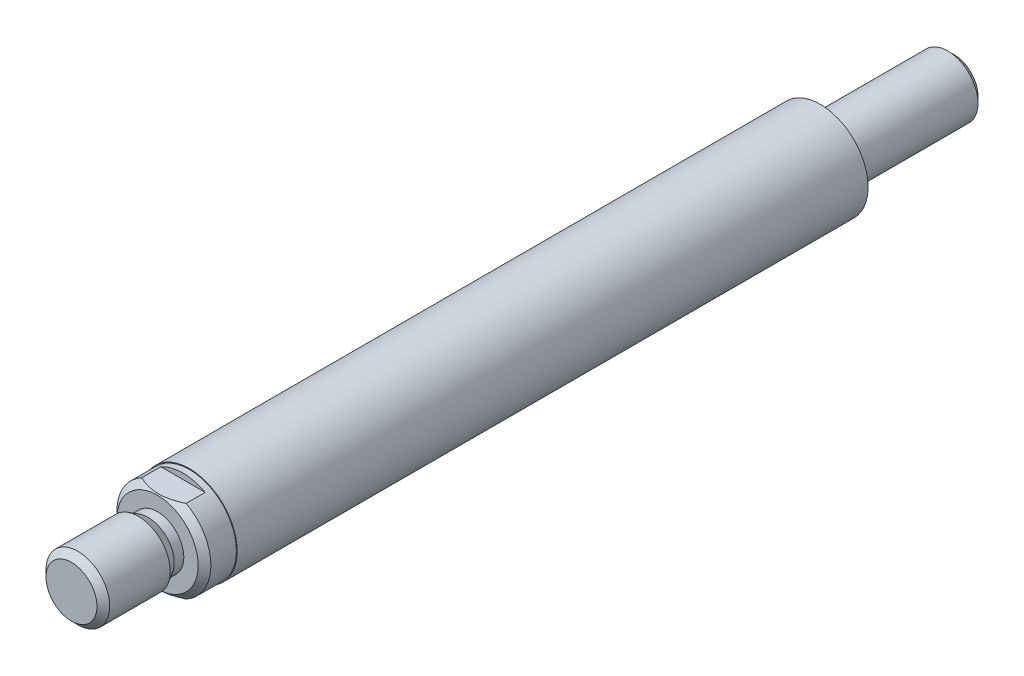
ISO-10303-21;
HEADER;
FILE_DESCRIPTION(('STEP AP214'),'2;1');
FILE_NAME('part.step','',(''),(''),'','','');
FILE_SCHEMA(('AUTOMOTIVE_DESIGN { 1 0 10303 214 1 1 1 1 }'));
ENDSEC;
DATA;
#1=APPLICATION_CONTEXT('core data for automotive mechanical design processes');
#2=APPLICATION_PROTOCOL_DEFINITION('international standard','automotive_design',2000,#1);
#3=PRODUCT_CONTEXT('',#1,'mechanical');
#4=PRODUCT('Part','Part','',(#3));
#5=PRODUCT_RELATED_PRODUCT_CATEGORY('part','',(#4));
#6=PRODUCT_DEFINITION_FORMATION('','',#4);
#7=PRODUCT_DEFINITION_CONTEXT('part definition',#1,'design');
#8=PRODUCT_DEFINITION('design','',#6,#7);
#9=PRODUCT_DEFINITION_SHAPE('','',#8);
#10=(LENGTH_UNIT() NAMED_UNIT(*) SI_UNIT(.MILLI.,.METRE.));
#11=(NAMED_UNIT(*) PLANE_ANGLE_UNIT() SI_UNIT($,.RADIAN.));
#12=(NAMED_UNIT(*) SI_UNIT($,.STERADIAN.) SOLID_ANGLE_UNIT());
#13=UNCERTAINTY_MEASURE_WITH_UNIT(LENGTH_MEASURE(1.E-05),#10,'distance_accuracy_value','');
#14=(GEOMETRIC_REPRESENTATION_CONTEXT(3) GLOBAL_UNCERTAINTY_ASSIGNED_CONTEXT((#13)) GLOBAL_UNIT_ASSIGNED_CONTEXT((#10,
#11,#12)) REPRESENTATION_CONTEXT('',''));
#15=CARTESIAN_POINT('',(0.,0.,0.));
#16=DIRECTION('',(0.,0.,1.));
#17=DIRECTION('',(1.,0.,0.));
#18=AXIS2_PLACEMENT_3D('',#15,#16,#17);
#19=CARTESIAN_POINT('',(0.,0.,277.));
#20=DIRECTION('',(0.,0.,-1.));
#21=DIRECTION('',(-1.,0.,0.));
#22=AXIS2_PLACEMENT_3D('',#19,#20,#21);
#23=CYLINDRICAL_SURFACE('',#22,15.);
#24=CARTESIAN_POINT('',(0.,0.,240.));
#25=DIRECTION('',(0.,0.,1.));
#26=DIRECTION('',(1.,0.,0.));
#27=AXIS2_PLACEMENT_3D('',#24,#25,#26);
#28=CIRCLE('',#27,15.);
#29=CARTESIAN_POINT('',(15.,0.,240.));
#30=VERTEX_POINT('',#29);
#31=EDGE_CURVE('E95',#30,#30,#28,.T.);
#32=ORIENTED_EDGE('',*,*,#31,.F.);
#33=EDGE_LOOP('',(#32));
#34=FACE_BOUND('',#33,.T.);
#35=CARTESIAN_POINT('',(0.,0.,42.));
#36=DIRECTION('',(0.,0.,-1.));
#37=DIRECTION('',(-1.,0.,0.));
#38=AXIS2_PLACEMENT_3D('',#35,#36,#37);
#39=CIRCLE('',#38,15.);
#40=CARTESIAN_POINT('',(-15.,0.,42.));
#41=VERTEX_POINT('',#40);
#42=EDGE_CURVE('E101',#41,#41,#39,.T.);
#43=ORIENTED_EDGE('',*,*,#42,.F.);
#44=EDGE_LOOP('',(#43));
#45=FACE_BOUND('',#44,.T.);
#46=ADVANCED_FACE('F34',(#34,#45),#23,.T.);
#47=CARTESIAN_POINT('',(0.,0.,240.));
#48=DIRECTION('',(0.,0.,1.));
#49=DIRECTION('',(1.,0.,0.));
#50=AXIS2_PLACEMENT_3D('',#47,#48,#49);
#51=CYLINDRICAL_SURFACE('',#50,14.75);
#52=CARTESIAN_POINT('',(0.,0.,240.));
#53=DIRECTION('',(0.,0.,1.));
#54=DIRECTION('',(1.,0.,0.));
#55=AXIS2_PLACEMENT_3D('',#52,#53,#54);
#56=CIRCLE('',#55,14.75);
#57=CARTESIAN_POINT('',(14.75,0.,240.));
#58=VERTEX_POINT('',#57);
#59=EDGE_CURVE('E96',#58,#58,#56,.T.);
#60=ORIENTED_EDGE('',*,*,#59,.T.);
#61=EDGE_LOOP('',(#60));
#62=FACE_BOUND('',#61,.T.);
#63=CARTESIAN_POINT('',(0.,0.,248.));
#64=DIRECTION('',(0.,0.,1.));
#65=DIRECTION('',(1.,0.,0.));
#66=AXIS2_PLACEMENT_3D('',#63,#64,#65);
#67=CIRCLE('',#66,14.75);
#68=CARTESIAN_POINT('',(6.96867993238318,13.,248.));
#69=VERTEX_POINT('',#68);
#70=CARTESIAN_POINT('',(6.96867993238318,-13.,248.));
#71=VERTEX_POINT('',#70);
#72=EDGE_CURVE('E91',#69,#71,#67,.F.);
#73=ORIENTED_EDGE('',*,*,#72,.T.);
#74=DIRECTION('',(0.,0.,1.));
#75=VECTOR('',#74,1.);
#76=CARTESIAN_POINT('',(6.96867993238318,-13.,240.));
#77=LINE('',#76,#75);
#78=CARTESIAN_POINT('',(6.96867993238318,-13.,242.));
#79=VERTEX_POINT('',#78);
#80=EDGE_CURVE('E47',#79,#71,#77,.T.);
#81=ORIENTED_EDGE('',*,*,#80,.F.);
#82=CARTESIAN_POINT('',(0.,0.,242.));
#83=DIRECTION('',(0.,0.,-1.));
#84=DIRECTION('',(-1.,0.,0.));
#85=AXIS2_PLACEMENT_3D('',#82,#83,#84);
#86=CIRCLE('',#85,14.75);
#87=CARTESIAN_POINT('',(-6.96867993238318,-13.,242.));
#88=VERTEX_POINT('',#87);
#89=EDGE_CURVE('E86',#79,#88,#86,.T.);
#90=ORIENTED_EDGE('',*,*,#89,.T.);
#91=DIRECTION('',(0.,0.,1.));
#92=VECTOR('',#91,1.);
#93=CARTESIAN_POINT('',(-6.96867993238318,-13.,240.));
#94=LINE('',#93,#92);
#95=CARTESIAN_POINT('',(-6.96867993238318,-13.,248.));
#96=VERTEX_POINT('',#95);
#97=EDGE_CURVE('E77',#96,#88,#94,.F.);
#98=ORIENTED_EDGE('',*,*,#97,.F.);
#99=CARTESIAN_POINT('',(-6.96867993238318,13.,248.));
#100=VERTEX_POINT('',#99);
#101=EDGE_CURVE('E60',#96,#100,#67,.F.);
#102=ORIENTED_EDGE('',*,*,#101,.T.);
#103=DIRECTION('',(0.,0.,1.));
#104=VECTOR('',#103,1.);
#105=CARTESIAN_POINT('',(-6.96867993238318,13.,240.));
#106=LINE('',#105,#104);
#107=CARTESIAN_POINT('',(-6.96867993238318,13.,242.));
#108=VERTEX_POINT('',#107);
#109=EDGE_CURVE('E198',#108,#100,#106,.T.);
#110=ORIENTED_EDGE('',*,*,#109,.F.);
#111=CARTESIAN_POINT('',(0.,0.,242.));
#112=DIRECTION('',(0.,0.,1.));
#113=DIRECTION('',(1.,0.,0.));
#114=AXIS2_PLACEMENT_3D('',#111,#112,#113);
#115=CIRCLE('',#114,14.75);
#116=CARTESIAN_POINT('',(6.96867993238318,13.,242.));
#117=VERTEX_POINT('',#116);
#118=EDGE_CURVE('E162',#117,#108,#115,.T.);
#119=ORIENTED_EDGE('',*,*,#118,.F.);
#120=DIRECTION('',(0.,0.,1.));
#121=VECTOR('',#120,1.);
#122=CARTESIAN_POINT('',(6.96867993238318,13.,240.));
#123=LINE('',#122,#121);
#124=EDGE_CURVE('E180',#69,#117,#123,.F.);
#125=ORIENTED_EDGE('',*,*,#124,.F.);
#126=EDGE_LOOP('',(#73,#81,#90,#98,#102,#110,#119,#125));
#127=FACE_BOUND('',#126,.T.);
#128=ADVANCED_FACE('F84',(#62,#127),#51,.T.);
#129=CARTESIAN_POINT('',(0.,0.,248.));
#130=DIRECTION('',(0.,0.,-1.));
#131=DIRECTION('',(-1.,0.,0.));
#132=AXIS2_PLACEMENT_3D('',#129,#130,#131);
#133=CONICAL_SURFACE('',#132,14.75,0.785398163397448);
#134=CARTESIAN_POINT('',(0.,0.,250.));
#135=DIRECTION('',(0.,0.,1.));
#136=DIRECTION('',(1.,0.,0.));
#137=AXIS2_PLACEMENT_3D('',#134,#135,#136);
#138=CIRCLE('',#137,12.75);
#139=CARTESIAN_POINT('',(12.75,0.,250.));
#140=VERTEX_POINT('',#139);
#141=EDGE_CURVE('E92',#140,#140,#138,.T.);
#142=ORIENTED_EDGE('',*,*,#141,.F.);
#143=EDGE_LOOP('',(#142));
#144=FACE_BOUND('',#143,.T.);
#145=ORIENTED_EDGE('',*,*,#101,.F.);
#146=CARTESIAN_POINT('',(-35.4910990793987,-13.,224.952935115757));
#147=CARTESIAN_POINT('',(-35.0828173088471,-13.,225.33630537597));
#148=CARTESIAN_POINT('',(-34.674147933697,-13.,225.719262727166));
#149=CARTESIAN_POINT('',(-33.8559475252934,-13.,226.484257250816));
#150=CARTESIAN_POINT('',(-33.4464164904877,-13.,226.86629442161));
#151=CARTESIAN_POINT('',(-32.2163639102178,-13.,228.010918828057));
#152=CARTESIAN_POINT('',(-31.3944222292085,-13.,228.771981983983));
#153=CARTESIAN_POINT('',(-29.7437484863501,-13.,230.291010876218));
#154=CARTESIAN_POINT('',(-28.9150043600984,-13.,231.048963509946));
#155=CARTESIAN_POINT('',(-27.2516868452359,-13.,232.558410104139));
#156=CARTESIAN_POINT('',(-26.4171136229163,-13.,233.309904247498));
#157=CARTESIAN_POINT('',(-25.1160709921524,-13.,234.46973699041));
#158=CARTESIAN_POINT('',(-24.6521923814303,-13.,234.880982156308));
#159=CARTESIAN_POINT('',(-23.7218122294561,-13.,235.700493445322));
#160=CARTESIAN_POINT('',(-23.2553106984609,-13.,236.108759580072));
#161=CARTESIAN_POINT('',(-22.3192216557875,-13.,236.921839820095));
#162=CARTESIAN_POINT('',(-21.8496338286346,-13.,237.326653562438));
#163=CARTESIAN_POINT('',(-20.9069168108555,-13.,238.132137193708));
#164=CARTESIAN_POINT('',(-20.4337876325126,-13.,238.532807096997));
#165=CARTESIAN_POINT('',(-19.4840286328975,-13.,239.328636508704));
#166=CARTESIAN_POINT('',(-19.0074045760675,-13.,239.723802888202));
#167=CARTESIAN_POINT('',(-18.0492434599848,-13.,240.508160224097));
#168=CARTESIAN_POINT('',(-17.5677063186315,-13.,240.897351080366));
#169=CARTESIAN_POINT('',(-16.5988758651192,-13.,241.668334692822));
#170=CARTESIAN_POINT('',(-16.1115835995403,-13.,242.050128761774));
#171=CARTESIAN_POINT('',(-15.1300127238084,-13.,242.804609019469));
#172=CARTESIAN_POINT('',(-14.6357344520457,-13.,243.17729564699));
#173=CARTESIAN_POINT('',(-13.7337231200548,-13.,243.841254964097));
#174=CARTESIAN_POINT('',(-13.3274493186847,-13.,244.134506974838));
#175=CARTESIAN_POINT('',(-12.5083964865482,-13.,244.711831155408));
#176=CARTESIAN_POINT('',(-12.0956173073763,-13.,244.995903115361));
#177=CARTESIAN_POINT('',(-11.2617602045165,-13.,245.553172951029));
#178=CARTESIAN_POINT('',(-10.8406696149606,-13.,245.826351946215));
#179=CARTESIAN_POINT('',(-9.98957821532378,-13.,246.35849797663));
#180=CARTESIAN_POINT('',(-9.55957775129747,-13.,246.617465562404));
#181=CARTESIAN_POINT('',(-8.69858937419742,-13.,247.11209835757));
#182=CARTESIAN_POINT('',(-8.26782209000679,-13.,247.348145253903));
#183=CARTESIAN_POINT('',(-7.39489650483254,-13.,247.798588797448));
#184=CARTESIAN_POINT('',(-6.95273580691168,-13.,248.012980841478));
#185=CARTESIAN_POINT('',(-6.05732380116903,-13.,248.413635291151));
#186=CARTESIAN_POINT('',(-5.60410984207143,-13.,248.599980346458));
#187=CARTESIAN_POINT('',(-4.68510825070332,-13.,248.938116849748));
#188=CARTESIAN_POINT('',(-4.21933036341625,-13.,249.089934262725));
#189=CARTESIAN_POINT('',(-3.42482378789764,-13.,249.3100164383));
#190=CARTESIAN_POINT('',(-3.09920813252235,-13.,249.389531023099));
#191=CARTESIAN_POINT('',(-2.44324582637381,-13.,249.526285786788));
#192=CARTESIAN_POINT('',(-2.11289881571584,-13.,249.583524261844));
#193=CARTESIAN_POINT('',(-1.44985155680667,-13.,249.673511177258));
#194=CARTESIAN_POINT('',(-1.11716123840419,-13.,249.706331997889));
#195=CARTESIAN_POINT('',(-0.450229399720359,-13.,249.746466359492));
#196=CARTESIAN_POINT('',(-0.115987839332152,-13.,249.753779237244));
#197=CARTESIAN_POINT('',(0.609141184116613,-13.,249.741605845032));
#198=CARTESIAN_POINT('',(0.999955774168483,-13.,249.717330327912));
#199=CARTESIAN_POINT('',(1.77796672740175,-13.,249.634689762452));
#200=CARTESIAN_POINT('',(2.16516235041698,-13.,249.576317889156));
#201=CARTESIAN_POINT('',(2.93790915587847,-13.,249.427619803399));
#202=CARTESIAN_POINT('',(3.32339023221287,-13.,249.336933869307));
#203=CARTESIAN_POINT('',(4.08655975914566,-13.,249.127767744407));
#204=CARTESIAN_POINT('',(4.46424953219324,-13.,249.009292313362));
#205=CARTESIAN_POINT('',(5.27344167440037,-13.,248.727076557814));
#206=CARTESIAN_POINT('',(5.70345083481803,-13.,248.559085448678));
#207=CARTESIAN_POINT('',(6.5524717593689,-13.,248.197086717852));
#208=CARTESIAN_POINT('',(6.97147823106257,-13.,248.003066840484));
#209=CARTESIAN_POINT('',(7.80050509800144,-13.,247.59356395022));
#210=CARTESIAN_POINT('',(8.21049134322258,-13.,247.378012336968));
#211=CARTESIAN_POINT('',(9.02109040699904,-13.,246.930203334429));
#212=CARTESIAN_POINT('',(9.42170469879567,-13.,246.697948594528));
#213=CARTESIAN_POINT('',(10.1977905747135,-13.,246.230216826921));
#214=CARTESIAN_POINT('',(10.573604033043,-13.,245.995304105664));
#215=CARTESIAN_POINT('',(11.3187378105875,-13.,245.515364753732));
#216=CARTESIAN_POINT('',(11.6880576107058,-13.,245.270337319692));
#217=CARTESIAN_POINT('',(12.4180356952706,-13.,244.774004008209));
#218=CARTESIAN_POINT('',(12.778740061626,-13.,244.522765659917));
#219=CARTESIAN_POINT('',(13.4951692284556,-13.,244.013491173384));
#220=CARTESIAN_POINT('',(13.8508954135524,-13.,243.75545698528));
#221=CARTESIAN_POINT('',(14.2045345766612,-13.,243.494642238079));
#222=B_SPLINE_CURVE_WITH_KNOTS('',3,(#146,#147,#148,#149,#150,#151,#152,#153,#154,#155,#156,
#157,#158,#159,#160,#161,#162,#163,#164,#165,#166,#167,#168,#169,#170,#171,#172,#173,#174,#175,
#176,#177,#178,#179,#180,#181,#182,#183,#184,#185,#186,#187,#188,#189,#190,#191,#192,#193,#194,
#195,#196,#197,#198,#199,#200,#201,#202,#203,#204,#205,#206,#207,#208,#209,#210,#211,#212,#213,
#214,#215,#216,#217,#218,#219,#220,#221),.UNSPECIFIED.,.F.,.F.,(4,2,2,2,2,2,2,2,2,2,2,2,2,2,2,2,
2,2,2,2,2,2,2,2,2,2,2,2,2,2,2,2,2,2,2,2,2,4),(0.,1.68017820642137,3.36035944221643,
6.7208838767056,10.0901001193997,13.4592206352693,15.3189829483062,17.1787379938929,
19.0386861917227,20.8986279412491,22.7559903924539,24.6133839323549,26.4704447492483,
28.327415919483,29.8304765095393,31.3335714383129,32.8391674518472,34.3447050980725,
35.8178249446408,37.2912572768936,38.760258867223,40.2281520796941,41.2330334892523,
42.2379917441521,43.2399590408233,44.2419523889779,45.4150388927982,46.5883602899583,
47.775173595717,48.961783773275,50.3456771778301,51.7302244923535,53.1193329165395,
54.5082214896935,55.8376092051433,57.1671027117618,58.485749912005,59.8040227492889),.UNSPECIFIED.);
#223=EDGE_CURVE('E72',#71,#96,#222,.F.);
#224=ORIENTED_EDGE('',*,*,#223,.F.);
#225=ORIENTED_EDGE('',*,*,#72,.F.);
#226=CARTESIAN_POINT('',(-35.4910990793987,13.,224.952935115757));
#227=CARTESIAN_POINT('',(-35.0828173088471,13.,225.33630537597));
#228=CARTESIAN_POINT('',(-34.674147933697,13.,225.719262727166));
#229=CARTESIAN_POINT('',(-33.8559475252934,13.,226.484257250816));
#230=CARTESIAN_POINT('',(-33.4464164904877,13.,226.86629442161));
#231=CARTESIAN_POINT('',(-32.2163639102178,13.,228.010918828057));
#232=CARTESIAN_POINT('',(-31.3944222292085,13.,228.771981983983));
#233=CARTESIAN_POINT('',(-29.7437484863501,13.,230.291010876218));
#234=CARTESIAN_POINT('',(-28.9150043600984,13.,231.048963509946));
#235=CARTESIAN_POINT('',(-27.2516868452359,13.,232.558410104139));
#236=CARTESIAN_POINT('',(-26.4171136229163,13.,233.309904247498));
#237=CARTESIAN_POINT('',(-25.1160709921524,13.,234.46973699041));
#238=CARTESIAN_POINT('',(-24.6521923814303,13.,234.880982156308));
#239=CARTESIAN_POINT('',(-23.7218122294561,13.,235.700493445322));
#240=CARTESIAN_POINT('',(-23.2553106984609,13.,236.108759580072));
#241=CARTESIAN_POINT('',(-22.3192216557875,13.,236.921839820095));
#242=CARTESIAN_POINT('',(-21.8496338286346,13.,237.326653562438));
#243=CARTESIAN_POINT('',(-20.9069168108555,13.,238.132137193708));
#244=CARTESIAN_POINT('',(-20.4337876325126,13.,238.532807096997));
#245=CARTESIAN_POINT('',(-19.4840286328975,13.,239.328636508704));
#246=CARTESIAN_POINT('',(-19.0074045760675,13.,239.723802888202));
#247=CARTESIAN_POINT('',(-18.0492434599848,13.,240.508160224097));
#248=CARTESIAN_POINT('',(-17.5677063186315,13.,240.897351080366));
#249=CARTESIAN_POINT('',(-16.5988758651192,13.,241.668334692822));
#250=CARTESIAN_POINT('',(-16.1115835995403,13.,242.050128761774));
#251=CARTESIAN_POINT('',(-15.1300127238084,13.,242.804609019469));
#252=CARTESIAN_POINT('',(-14.6357344520457,13.,243.17729564699));
#253=CARTESIAN_POINT('',(-13.7337231200548,13.,243.841254964097));
#254=CARTESIAN_POINT('',(-13.3274493186847,13.,244.134506974838));
#255=CARTESIAN_POINT('',(-12.5083964865482,13.,244.711831155408));
#256=CARTESIAN_POINT('',(-12.0956173073763,13.,244.995903115361));
#257=CARTESIAN_POINT('',(-11.2617602045165,13.,245.553172951029));
#258=CARTESIAN_POINT('',(-10.8406696149606,13.,245.826351946215));
#259=CARTESIAN_POINT('',(-9.98957821532378,13.,246.35849797663));
#260=CARTESIAN_POINT('',(-9.55957775129747,13.,246.617465562404));
#261=CARTESIAN_POINT('',(-8.69858937419742,13.,247.11209835757));
#262=CARTESIAN_POINT('',(-8.26782209000679,13.,247.348145253903));
#263=CARTESIAN_POINT('',(-7.39489650483254,13.,247.798588797448));
#264=CARTESIAN_POINT('',(-6.95273580691168,13.,248.012980841478));
#265=CARTESIAN_POINT('',(-6.05732380116903,13.,248.413635291151));
#266=CARTESIAN_POINT('',(-5.60410984207143,13.,248.599980346458));
#267=CARTESIAN_POINT('',(-4.68510825070332,13.,248.938116849748));
#268=CARTESIAN_POINT('',(-4.21933036341625,13.,249.089934262725));
#269=CARTESIAN_POINT('',(-3.42482378789764,13.,249.3100164383));
#270=CARTESIAN_POINT('',(-3.09920813252235,13.,249.389531023099));
#271=CARTESIAN_POINT('',(-2.44324582637381,13.,249.526285786788));
#272=CARTESIAN_POINT('',(-2.11289881571584,13.,249.583524261844));
#273=CARTESIAN_POINT('',(-1.44985155680667,13.,249.673511177258));
#274=CARTESIAN_POINT('',(-1.11716123840419,13.,249.706331997889));
#275=CARTESIAN_POINT('',(-0.450229399720359,13.,249.746466359492));
#276=CARTESIAN_POINT('',(-0.115987839332152,13.,249.753779237244));
#277=CARTESIAN_POINT('',(0.609141184116613,13.,249.741605845032));
#278=CARTESIAN_POINT('',(0.999955774168483,13.,249.717330327912));
#279=CARTESIAN_POINT('',(1.77796672740175,13.,249.634689762452));
#280=CARTESIAN_POINT('',(2.16516235041698,13.,249.576317889156));
#281=CARTESIAN_POINT('',(2.93790915587847,13.,249.427619803399));
#282=CARTESIAN_POINT('',(3.32339023221287,13.,249.336933869307));
#283=CARTESIAN_POINT('',(4.08655975914566,13.,249.127767744407));
#284=CARTESIAN_POINT('',(4.46424953219324,13.,249.009292313362));
#285=CARTESIAN_POINT('',(5.27344167440037,13.,248.727076557814));
#286=CARTESIAN_POINT('',(5.70345083481803,13.,248.559085448678));
#287=CARTESIAN_POINT('',(6.5524717593689,13.,248.197086717852));
#288=CARTESIAN_POINT('',(6.97147823106257,13.,248.003066840484));
#289=CARTESIAN_POINT('',(7.80050509800144,13.,247.59356395022));
#290=CARTESIAN_POINT('',(8.21049134322258,13.,247.378012336968));
#291=CARTESIAN_POINT('',(9.02109040699904,13.,246.930203334429));
#292=CARTESIAN_POINT('',(9.42170469879567,13.,246.697948594528));
#293=CARTESIAN_POINT('',(10.1977905747135,13.,246.230216826921));
#294=CARTESIAN_POINT('',(10.573604033043,13.,245.995304105664));
#295=CARTESIAN_POINT('',(11.3187378105875,13.,245.515364753732));
#296=CARTESIAN_POINT('',(11.6880576107058,13.,245.270337319692));
#297=CARTESIAN_POINT('',(12.4180356952706,13.,244.774004008209));
#298=CARTESIAN_POINT('',(12.778740061626,13.,244.522765659917));
#299=CARTESIAN_POINT('',(13.4951692284556,13.,244.013491173384));
#300=CARTESIAN_POINT('',(13.8508954135524,13.,243.75545698528));
#301=CARTESIAN_POINT('',(14.2045345766612,13.,243.494642238079));
#302=B_SPLINE_CURVE_WITH_KNOTS('',3,(#226,#227,#228,#229,#230,#231,#232,#233,#234,#235,#236,
#237,#238,#239,#240,#241,#242,#243,#244,#245,#246,#247,#248,#249,#250,#251,#252,#253,#254,#255,
#256,#257,#258,#259,#260,#261,#262,#263,#264,#265,#266,#267,#268,#269,#270,#271,#272,#273,#274,
#275,#276,#277,#278,#279,#280,#281,#282,#283,#284,#285,#286,#287,#288,#289,#290,#291,#292,#293,
#294,#295,#296,#297,#298,#299,#300,#301),.UNSPECIFIED.,.F.,.F.,(4,2,2,2,2,2,2,2,2,2,2,2,2,2,2,2,
2,2,2,2,2,2,2,2,2,2,2,2,2,2,2,2,2,2,2,2,2,4),(0.,1.68017820642137,3.36035944221643,
6.7208838767056,10.0901001193997,13.4592206352693,15.3189829483062,17.1787379938929,
19.0386861917227,20.8986279412491,22.7559903924539,24.6133839323549,26.4704447492483,
28.327415919483,29.8304765095393,31.3335714383129,32.8391674518472,34.3447050980725,
35.8178249446408,37.2912572768936,38.760258867223,40.2281520796941,41.2330334892523,
42.2379917441521,43.2399590408233,44.2419523889779,45.4150388927982,46.5883602899583,
47.775173595717,48.961783773275,50.3456771778301,51.7302244923535,53.1193329165395,
54.5082214896935,55.8376092051433,57.1671027117618,58.485749912005,59.8040227492889),.UNSPECIFIED.);
#303=EDGE_CURVE('E89',#100,#69,#302,.T.);
#304=ORIENTED_EDGE('',*,*,#303,.F.);
#305=EDGE_LOOP('',(#145,#224,#225,#304));
#306=FACE_BOUND('',#305,.T.);
#307=ADVANCED_FACE('F87',(#144,#306),#133,.T.);
#308=CARTESIAN_POINT('',(0.,0.,240.));
#309=DIRECTION('',(0.,0.,1.));
#310=DIRECTION('',(1.,0.,0.));
#311=AXIS2_PLACEMENT_3D('',#308,#309,#310);
#312=PLANE('',#311);
#313=ORIENTED_EDGE('',*,*,#59,.F.);
#314=EDGE_LOOP('',(#313));
#315=FACE_BOUND('',#314,.T.);
#316=ORIENTED_EDGE('',*,*,#31,.T.);
#317=EDGE_LOOP('',(#316));
#318=FACE_BOUND('',#317,.T.);
#319=ADVANCED_FACE('F207',(#315,#318),#312,.T.);
#320=CARTESIAN_POINT('',(0.,0.,250.));
#321=DIRECTION('',(0.,0.,1.));
#322=DIRECTION('',(1.,0.,0.));
#323=AXIS2_PLACEMENT_3D('',#320,#321,#322);
#324=PLANE('',#323);
#325=ORIENTED_EDGE('',*,*,#141,.T.);
#326=EDGE_LOOP('',(#325));
#327=FACE_BOUND('',#326,.T.);
#328=CARTESIAN_POINT('',(0.,0.,250.));
#329=DIRECTION('',(0.,0.,1.));
#330=DIRECTION('',(1.,0.,0.));
#331=AXIS2_PLACEMENT_3D('',#328,#329,#330);
#332=CIRCLE('',#331,8.25);
#333=CARTESIAN_POINT('',(8.25,0.,250.));
#334=VERTEX_POINT('',#333);
#335=EDGE_CURVE('E204',#334,#334,#332,.T.);
#336=ORIENTED_EDGE('',*,*,#335,.F.);
#337=EDGE_LOOP('',(#336));
#338=FACE_BOUND('',#337,.T.);
#339=ADVANCED_FACE('F211',(#327,#338),#324,.T.);
#340=CARTESIAN_POINT('',(0.,0.,253.));
#341=DIRECTION('',(0.,0.,-1.));
#342=DIRECTION('',(-1.,0.,0.));
#343=AXIS2_PLACEMENT_3D('',#340,#341,#342);
#344=CYLINDRICAL_SURFACE('',#343,8.25);
#345=CARTESIAN_POINT('',(0.,0.,253.));
#346=DIRECTION('',(0.,0.,-1.));
#347=DIRECTION('',(-1.,0.,0.));
#348=AXIS2_PLACEMENT_3D('',#345,#346,#347);
#349=CIRCLE('',#348,8.25);
#350=CARTESIAN_POINT('',(-8.25,0.,253.));
#351=VERTEX_POINT('',#350);
#352=EDGE_CURVE('E199',#351,#351,#349,.T.);
#353=ORIENTED_EDGE('',*,*,#352,.T.);
#354=EDGE_LOOP('',(#353));
#355=FACE_BOUND('',#354,.T.);
#356=ORIENTED_EDGE('',*,*,#335,.T.);
#357=EDGE_LOOP('',(#356));
#358=FACE_BOUND('',#357,.T.);
#359=ADVANCED_FACE('F219',(#355,#358),#344,.T.);
#360=CARTESIAN_POINT('',(0.,0.,256.));
#361=DIRECTION('',(0.,0.,-1.));
#362=DIRECTION('',(-1.,0.,0.));
#363=AXIS2_PLACEMENT_3D('',#360,#361,#362);
#364=PLANE('',#363);
#365=CARTESIAN_POINT('',(0.,0.,256.));
#366=DIRECTION('',(0.,0.,-1.));
#367=DIRECTION('',(-1.,0.,0.));
#368=AXIS2_PLACEMENT_3D('',#365,#366,#367);
#369=CIRCLE('',#368,10.);
#370=CARTESIAN_POINT('',(-10.,0.,256.));
#371=VERTEX_POINT('',#370);
#372=EDGE_CURVE('E99',#371,#371,#369,.F.);
#373=ORIENTED_EDGE('',*,*,#372,.F.);
#374=EDGE_LOOP('',(#373));
#375=FACE_BOUND('',#374,.T.);
#376=CARTESIAN_POINT('',(0.,0.,256.));
#377=DIRECTION('',(0.,0.,-1.));
#378=DIRECTION('',(-1.,0.,0.));
#379=AXIS2_PLACEMENT_3D('',#376,#377,#378);
#380=CIRCLE('',#379,9.98205080756888);
#381=CARTESIAN_POINT('',(-9.98205080756888,0.,256.));
#382=VERTEX_POINT('',#381);
#383=EDGE_CURVE('E200',#382,#382,#380,.T.);
#384=ORIENTED_EDGE('',*,*,#383,.F.);
#385=EDGE_LOOP('',(#384));
#386=FACE_BOUND('',#385,.T.);
#387=ADVANCED_FACE('F240',(#375,#386),#364,.T.);
#388=CARTESIAN_POINT('',(0.,0.,253.));
#389=DIRECTION('',(0.,0.,1.));
#390=DIRECTION('',(-1.,0.,0.));
#391=AXIS2_PLACEMENT_3D('',#388,#389,#390);
#392=CONICAL_SURFACE('',#391,8.25,0.5235987755983);
#393=ORIENTED_EDGE('',*,*,#383,.T.);
#394=EDGE_LOOP('',(#393));
#395=FACE_BOUND('',#394,.T.);
#396=ORIENTED_EDGE('',*,*,#352,.F.);
#397=EDGE_LOOP('',(#396));
#398=FACE_BOUND('',#397,.T.);
#399=ADVANCED_FACE('F227',(#395,#398),#392,.T.);
#400=CARTESIAN_POINT('',(0.,0.,277.));
#401=DIRECTION('',(0.,0.,1.));
#402=DIRECTION('',(1.,0.,0.));
#403=AXIS2_PLACEMENT_3D('',#400,#401,#402);
#404=PLANE('',#403);
#405=CARTESIAN_POINT('',(0.,0.,277.));
#406=DIRECTION('',(0.,0.,1.));
#407=DIRECTION('',(1.,0.,0.));
#408=AXIS2_PLACEMENT_3D('',#405,#406,#407);
#409=CIRCLE('',#408,7.99999999999996);
#410=CARTESIAN_POINT('',(7.99999999999996,0.,277.));
#411=VERTEX_POINT('',#410);
#412=EDGE_CURVE('E104',#411,#411,#409,.T.);
#413=ORIENTED_EDGE('',*,*,#412,.T.);
#414=EDGE_LOOP('',(#413));
#415=FACE_BOUND('',#414,.T.);
#416=ADVANCED_FACE('F226',(#415),#404,.T.);
#417=CARTESIAN_POINT('',(0.,0.,250.));
#418=DIRECTION('',(0.,0.,1.));
#419=DIRECTION('',(1.,0.,0.));
#420=AXIS2_PLACEMENT_3D('',#417,#418,#419);
#421=CYLINDRICAL_SURFACE('',#420,10.);
#422=CARTESIAN_POINT('',(0.,0.,275.));
#423=DIRECTION('',(0.,0.,1.));
#424=DIRECTION('',(1.,0.,0.));
#425=AXIS2_PLACEMENT_3D('',#422,#423,#424);
#426=CIRCLE('',#425,10.);
#427=CARTESIAN_POINT('',(10.,0.,275.));
#428=VERTEX_POINT('',#427);
#429=EDGE_CURVE('E106',#428,#428,#426,.F.);
#430=ORIENTED_EDGE('',*,*,#429,.T.);
#431=EDGE_LOOP('',(#430));
#432=FACE_BOUND('',#431,.T.);
#433=ORIENTED_EDGE('',*,*,#372,.T.);
#434=EDGE_LOOP('',(#433));
#435=FACE_BOUND('',#434,.T.);
#436=ADVANCED_FACE('F228',(#432,#435),#421,.T.);
#437=CARTESIAN_POINT('',(14.75,15.001,242.));
#438=DIRECTION('',(0.,0.,1.));
#439=DIRECTION('',(1.,0.,0.));
#440=AXIS2_PLACEMENT_3D('',#437,#438,#439);
#441=PLANE('',#440);
#442=ORIENTED_EDGE('',*,*,#118,.T.);
#443=DIRECTION('',(-1.,0.,0.));
#444=VECTOR('',#443,1.);
#445=CARTESIAN_POINT('',(14.75,13.,242.));
#446=LINE('',#445,#444);
#447=EDGE_CURVE('E166',#117,#108,#446,.T.);
#448=ORIENTED_EDGE('',*,*,#447,.F.);
#449=EDGE_LOOP('',(#442,#448));
#450=FACE_BOUND('',#449,.T.);
#451=ADVANCED_FACE('F187',(#450),#441,.T.);
#452=CARTESIAN_POINT('',(-14.75,13.,242.));
#453=DIRECTION('',(0.,1.,0.));
#454=DIRECTION('',(0.,0.,1.));
#455=AXIS2_PLACEMENT_3D('',#452,#453,#454);
#456=PLANE('',#455);
#457=ORIENTED_EDGE('',*,*,#109,.T.);
#458=ORIENTED_EDGE('',*,*,#303,.T.);
#459=ORIENTED_EDGE('',*,*,#124,.T.);
#460=ORIENTED_EDGE('',*,*,#447,.T.);
#461=EDGE_LOOP('',(#457,#458,#459,#460));
#462=FACE_BOUND('',#461,.T.);
#463=ADVANCED_FACE('F177',(#462),#456,.T.);
#464=CARTESIAN_POINT('',(14.75,-15.001,242.));
#465=DIRECTION('',(0.,0.,-1.));
#466=DIRECTION('',(-1.,0.,0.));
#467=AXIS2_PLACEMENT_3D('',#464,#465,#466);
#468=PLANE('',#467);
#469=DIRECTION('',(-1.,0.,0.));
#470=VECTOR('',#469,1.);
#471=CARTESIAN_POINT('',(14.75,-13.,242.));
#472=LINE('',#471,#470);
#473=EDGE_CURVE('E85',#79,#88,#472,.T.);
#474=ORIENTED_EDGE('',*,*,#473,.T.);
#475=ORIENTED_EDGE('',*,*,#89,.F.);
#476=EDGE_LOOP('',(#474,#475));
#477=FACE_BOUND('',#476,.T.);
#478=ADVANCED_FACE('F148',(#477),#468,.F.);
#479=CARTESIAN_POINT('',(-14.75,-13.,242.));
#480=DIRECTION('',(0.,-1.,0.));
#481=DIRECTION('',(0.,0.,1.));
#482=AXIS2_PLACEMENT_3D('',#479,#480,#481);
#483=PLANE('',#482);
#484=ORIENTED_EDGE('',*,*,#80,.T.);
#485=ORIENTED_EDGE('',*,*,#223,.T.);
#486=ORIENTED_EDGE('',*,*,#97,.T.);
#487=ORIENTED_EDGE('',*,*,#473,.F.);
#488=EDGE_LOOP('',(#484,#485,#486,#487));
#489=FACE_BOUND('',#488,.T.);
#490=ADVANCED_FACE('F78',(#489),#483,.T.);
#491=CARTESIAN_POINT('',(0.,0.,42.));
#492=DIRECTION('',(0.,0.,-1.));
#493=DIRECTION('',(-1.,0.,0.));
#494=AXIS2_PLACEMENT_3D('',#491,#492,#493);
#495=PLANE('',#494);
#496=CARTESIAN_POINT('',(0.,0.,42.));
#497=DIRECTION('',(0.,0.,-1.));
#498=DIRECTION('',(-1.,0.,0.));
#499=AXIS2_PLACEMENT_3D('',#496,#497,#498);
#500=CIRCLE('',#499,9.5);
#501=CARTESIAN_POINT('',(-9.5,0.,42.));
#502=VERTEX_POINT('',#501);
#503=EDGE_CURVE('E109',#502,#502,#500,.T.);
#504=ORIENTED_EDGE('',*,*,#503,.F.);
#505=EDGE_LOOP('',(#504));
#506=FACE_BOUND('',#505,.T.);
#507=ORIENTED_EDGE('',*,*,#42,.T.);
#508=EDGE_LOOP('',(#507));
#509=FACE_BOUND('',#508,.T.);
#510=ADVANCED_FACE('F137',(#506,#509),#495,.T.);
#511=CARTESIAN_POINT('',(0.,0.,42.));
#512=DIRECTION('',(0.,0.,-1.));
#513=DIRECTION('',(-1.,0.,0.));
#514=AXIS2_PLACEMENT_3D('',#511,#512,#513);
#515=CYLINDRICAL_SURFACE('',#514,9.5);
#516=CARTESIAN_POINT('',(0.,0.,2.00000000000002));
#517=DIRECTION('',(0.,0.,1.));
#518=DIRECTION('',(1.,0.,0.));
#519=AXIS2_PLACEMENT_3D('',#516,#517,#518);
#520=CIRCLE('',#519,9.5);
#521=CARTESIAN_POINT('',(-9.5,0.,2.00000000000002));
#522=VERTEX_POINT('',#521);
#523=EDGE_CURVE('E11',#522,#522,#520,.T.);
#524=CARTESIAN_POINT('',(-9.5,0.,2.00000000000002));
#525=CARTESIAN_POINT('',(-9.5,0.,2.41666666666668));
#526=CARTESIAN_POINT('',(-9.5,0.,2.83333333333335));
#527=CARTESIAN_POINT('',(-9.5,0.,3.66666666666668));
#528=CARTESIAN_POINT('',(-9.5,0.,4.08333333333335));
#529=CARTESIAN_POINT('',(-9.5,0.,4.91666666666668));
#530=CARTESIAN_POINT('',(-9.5,0.,5.33333333333335));
#531=CARTESIAN_POINT('',(-9.5,0.,6.16666666666668));
#532=CARTESIAN_POINT('',(-9.5,0.,6.58333333333335));
#533=CARTESIAN_POINT('',(-9.5,0.,7.41666666666668));
#534=CARTESIAN_POINT('',(-9.5,0.,7.83333333333335));
#535=CARTESIAN_POINT('',(-9.5,0.,8.66666666666668));
#536=CARTESIAN_POINT('',(-9.5,0.,9.08333333333335));
#537=CARTESIAN_POINT('',(-9.5,0.,9.91666666666668));
#538=CARTESIAN_POINT('',(-9.5,0.,10.3333333333333));
#539=CARTESIAN_POINT('',(-9.5,0.,11.1666666666667));
#540=CARTESIAN_POINT('',(-9.5,0.,11.5833333333333));
#541=CARTESIAN_POINT('',(-9.5,0.,12.4166666666667));
#542=CARTESIAN_POINT('',(-9.5,0.,12.8333333333333));
#543=CARTESIAN_POINT('',(-9.5,0.,13.6666666666667));
#544=CARTESIAN_POINT('',(-9.5,0.,14.0833333333333));
#545=CARTESIAN_POINT('',(-9.5,0.,14.9166666666667));
#546=CARTESIAN_POINT('',(-9.5,0.,15.3333333333333));
#547=CARTESIAN_POINT('',(-9.5,0.,16.1666666666667));
#548=CARTESIAN_POINT('',(-9.5,0.,16.5833333333333));
#549=CARTESIAN_POINT('',(-9.5,0.,17.4166666666667));
#550=CARTESIAN_POINT('',(-9.5,0.,17.8333333333333));
#551=CARTESIAN_POINT('',(-9.5,0.,18.6666666666667));
#552=CARTESIAN_POINT('',(-9.5,0.,19.0833333333333));
#553=CARTESIAN_POINT('',(-9.5,0.,19.9166666666667));
#554=CARTESIAN_POINT('',(-9.5,0.,20.3333333333333));
#555=CARTESIAN_POINT('',(-9.5,0.,21.1666666666667));
#556=CARTESIAN_POINT('',(-9.5,0.,21.5833333333333));
#557=CARTESIAN_POINT('',(-9.5,0.,22.4166666666667));
#558=CARTESIAN_POINT('',(-9.5,0.,22.8333333333333));
#559=CARTESIAN_POINT('',(-9.5,0.,23.6666666666667));
#560=CARTESIAN_POINT('',(-9.5,0.,24.0833333333333));
#561=CARTESIAN_POINT('',(-9.5,0.,24.9166666666667));
#562=CARTESIAN_POINT('',(-9.5,0.,25.3333333333333));
#563=CARTESIAN_POINT('',(-9.5,0.,26.1666666666667));
#564=CARTESIAN_POINT('',(-9.5,0.,26.5833333333333));
#565=CARTESIAN_POINT('',(-9.5,0.,27.4166666666667));
#566=CARTESIAN_POINT('',(-9.5,0.,27.8333333333333));
#567=CARTESIAN_POINT('',(-9.5,0.,28.6666666666667));
#568=CARTESIAN_POINT('',(-9.5,0.,29.0833333333333));
#569=CARTESIAN_POINT('',(-9.5,0.,29.9166666666667));
#570=CARTESIAN_POINT('',(-9.5,0.,30.3333333333333));
#571=CARTESIAN_POINT('',(-9.5,0.,31.1666666666667));
#572=CARTESIAN_POINT('',(-9.5,0.,31.5833333333333));
#573=CARTESIAN_POINT('',(-9.5,0.,32.4166666666667));
#574=CARTESIAN_POINT('',(-9.5,0.,32.8333333333333));
#575=CARTESIAN_POINT('',(-9.5,0.,33.6666666666667));
#576=CARTESIAN_POINT('',(-9.5,0.,34.0833333333333));
#577=CARTESIAN_POINT('',(-9.5,0.,34.9166666666667));
#578=CARTESIAN_POINT('',(-9.5,0.,35.3333333333333));
#579=CARTESIAN_POINT('',(-9.5,0.,36.1666666666667));
#580=CARTESIAN_POINT('',(-9.5,0.,36.5833333333333));
#581=CARTESIAN_POINT('',(-9.5,0.,37.4166666666667));
#582=CARTESIAN_POINT('',(-9.5,0.,37.8333333333333));
#583=CARTESIAN_POINT('',(-9.5,0.,38.6666666666667));
#584=CARTESIAN_POINT('',(-9.5,0.,39.0833333333333));
#585=CARTESIAN_POINT('',(-9.5,0.,39.9166666666667));
#586=CARTESIAN_POINT('',(-9.5,0.,40.3333333333333));
#587=CARTESIAN_POINT('',(-9.5,0.,41.1666666666667));
#588=CARTESIAN_POINT('',(-9.5,0.,41.5833333333333));
#589=CARTESIAN_POINT('',(-9.5,0.,42.));
#590=B_SPLINE_CURVE_WITH_KNOTS('',3,(#524,#525,#526,#527,#528,#529,#530,#531,#532,#533,#534,
#535,#536,#537,#538,#539,#540,#541,#542,#543,#544,#545,#546,#547,#548,#549,#550,#551,#552,#553,
#554,#555,#556,#557,#558,#559,#560,#561,#562,#563,#564,#565,#566,#567,#568,#569,#570,#571,#572,
#573,#574,#575,#576,#577,#578,#579,#580,#581,#582,#583,#584,#585,#586,#587,#588,#589),
.UNSPECIFIED.,.F.,.F.,(4,2,2,2,2,2,2,2,2,2,2,2,2,2,2,2,2,2,2,2,2,2,2,2,2,2,2,2,2,2,2,2,4),(0.,
1.25,2.5,3.75,5.,6.25,7.5,8.75,10.,11.25,12.5,13.75,15.,16.25,17.5,18.75,20.,21.25,22.5,23.75,
25.,26.25,27.5,28.75,30.,31.25,32.5,33.75,35.,36.25,37.5,38.75,40.),.UNSPECIFIED.);
#591=EDGE_CURVE('BSEAM141',#522,#502,#590,.T.);
#592=ORIENTED_EDGE('',*,*,#523,.T.);
#593=ORIENTED_EDGE('',*,*,#503,.T.);
#594=ORIENTED_EDGE('',*,*,#591,.T.);
#595=ORIENTED_EDGE('',*,*,#591,.F.);
#596=EDGE_LOOP('',(#592,#594,#593,#595));
#597=FACE_BOUND('',#596,.T.);
#598=ADVANCED_FACE('F141',(#597),#515,.T.);
#599=CARTESIAN_POINT('',(0.,0.,0.));
#600=DIRECTION('',(0.,0.,1.));
#601=DIRECTION('',(1.,0.,0.));
#602=AXIS2_PLACEMENT_3D('',#599,#600,#601);
#603=PLANE('',#602);
#604=CARTESIAN_POINT('',(0.,0.,0.));
#605=DIRECTION('',(0.,0.,1.));
#606=DIRECTION('',(1.,0.,0.));
#607=AXIS2_PLACEMENT_3D('',#604,#605,#606);
#608=CIRCLE('',#607,7.49999999999996);
#609=CARTESIAN_POINT('',(7.49999999999996,0.,0.));
#610=VERTEX_POINT('',#609);
#611=EDGE_CURVE('E45',#610,#610,#608,.F.);
#612=ORIENTED_EDGE('',*,*,#611,.T.);
#613=EDGE_LOOP('',(#612));
#614=FACE_BOUND('',#613,.T.);
#615=ADVANCED_FACE('F113',(#614),#603,.F.);
#616=CARTESIAN_POINT('',(0.,0.,277.));
#617=DIRECTION('',(0.,0.,-1.));
#618=DIRECTION('',(-1.,0.,0.));
#619=AXIS2_PLACEMENT_3D('',#616,#617,#618);
#620=CONICAL_SURFACE('',#619,7.99999999999996,0.785398163397458);
#621=ORIENTED_EDGE('',*,*,#429,.F.);
#622=EDGE_LOOP('',(#621));
#623=FACE_BOUND('',#622,.T.);
#624=ORIENTED_EDGE('',*,*,#412,.F.);
#625=EDGE_LOOP('',(#624));
#626=FACE_BOUND('',#625,.T.);
#627=ADVANCED_FACE('F118',(#623,#626),#620,.T.);
#628=CARTESIAN_POINT('',(0.,0.,0.));
#629=DIRECTION('',(0.,0.,1.));
#630=DIRECTION('',(1.,0.,0.));
#631=AXIS2_PLACEMENT_3D('',#628,#629,#630);
#632=CONICAL_SURFACE('',#631,7.49999999999996,0.785398163397454);
#633=ORIENTED_EDGE('',*,*,#523,.F.);
#634=EDGE_LOOP('',(#633));
#635=FACE_BOUND('',#634,.T.);
#636=ORIENTED_EDGE('',*,*,#611,.F.);
#637=EDGE_LOOP('',(#636));
#638=FACE_BOUND('',#637,.T.);
#639=ADVANCED_FACE('F116',(#635,#638),#632,.T.);
#640=CLOSED_SHELL('',(#46,#128,#307,#319,#339,#359,#387,#399,#416,#436,#451,#463,#478,#490,#510,
#598,#615,#627,#639));
#641=MANIFOLD_SOLID_BREP('B2',#640);
#642=ADVANCED_BREP_SHAPE_REPRESENTATION('',(#18,#641),#14);
#643=SHAPE_DEFINITION_REPRESENTATION(#9,#642);
ENDSEC;
END-ISO-10303-21;
